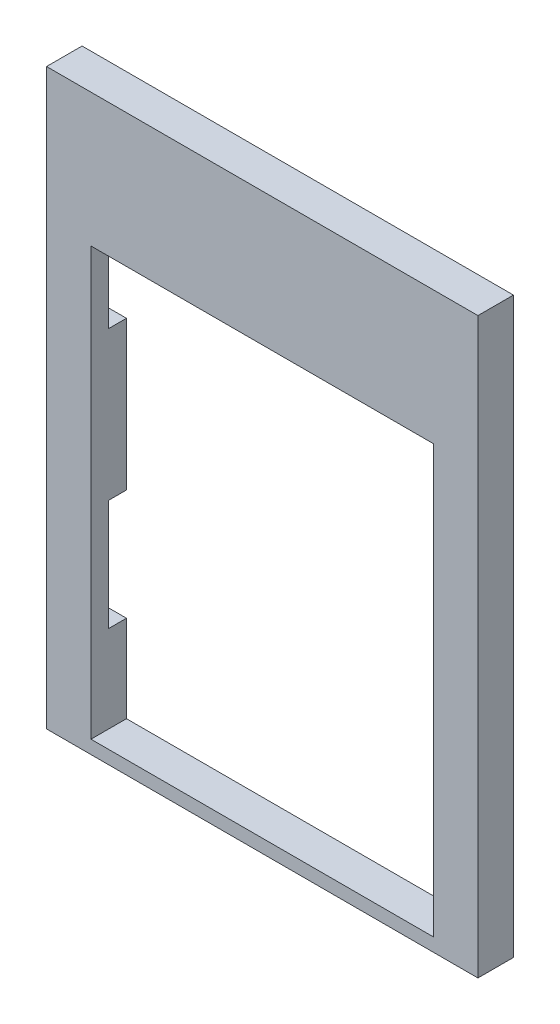
ISO-10303-21;
HEADER;
FILE_DESCRIPTION(('STEP AP214'),'2;1');
FILE_NAME('part.step','',(''),(''),'','','');
FILE_SCHEMA(('AUTOMOTIVE_DESIGN { 1 0 10303 214 1 1 1 1 }'));
ENDSEC;
DATA;
#1=APPLICATION_CONTEXT('core data for automotive mechanical design processes');
#2=APPLICATION_PROTOCOL_DEFINITION('international standard','automotive_design',2000,#1);
#3=PRODUCT_CONTEXT('',#1,'mechanical');
#4=PRODUCT('Part','Part','',(#3));
#5=PRODUCT_RELATED_PRODUCT_CATEGORY('part','',(#4));
#6=PRODUCT_DEFINITION_FORMATION('','',#4);
#7=PRODUCT_DEFINITION_CONTEXT('part definition',#1,'design');
#8=PRODUCT_DEFINITION('design','',#6,#7);
#9=PRODUCT_DEFINITION_SHAPE('','',#8);
#10=(LENGTH_UNIT() NAMED_UNIT(*) SI_UNIT(.MILLI.,.METRE.));
#11=(NAMED_UNIT(*) PLANE_ANGLE_UNIT() SI_UNIT($,.RADIAN.));
#12=(NAMED_UNIT(*) SI_UNIT($,.STERADIAN.) SOLID_ANGLE_UNIT());
#13=UNCERTAINTY_MEASURE_WITH_UNIT(LENGTH_MEASURE(1.E-05),#10,'distance_accuracy_value','');
#14=(GEOMETRIC_REPRESENTATION_CONTEXT(3) GLOBAL_UNCERTAINTY_ASSIGNED_CONTEXT((#13)) GLOBAL_UNIT_ASSIGNED_CONTEXT((#10,
#11,#12)) REPRESENTATION_CONTEXT('',''));
#15=CARTESIAN_POINT('',(0.,0.,0.));
#16=DIRECTION('',(0.,0.,1.));
#17=DIRECTION('',(1.,0.,0.));
#18=AXIS2_PLACEMENT_3D('',#15,#16,#17);
#19=CARTESIAN_POINT('',(92.1601774285357,0.,4.));
#20=DIRECTION('',(-1.,0.,0.));
#21=DIRECTION('',(0.,0.,1.));
#22=AXIS2_PLACEMENT_3D('',#19,#20,#21);
#23=PLANE('',#22);
#24=DIRECTION('',(0.,1.,0.));
#25=VECTOR('',#24,1.);
#26=CARTESIAN_POINT('',(92.1601774285357,0.,-4.));
#27=LINE('',#26,#25);
#28=CARTESIAN_POINT('',(92.1601774285357,-5.21485776415112,-4.));
#29=VERTEX_POINT('',#28);
#30=CARTESIAN_POINT('',(92.1601774285357,123.984602235849,-4.));
#31=VERTEX_POINT('',#30);
#32=EDGE_CURVE('E436',#29,#31,#27,.T.);
#33=ORIENTED_EDGE('',*,*,#32,.F.);
#34=DIRECTION('',(0.,0.,-1.));
#35=VECTOR('',#34,1.);
#36=CARTESIAN_POINT('',(92.1601774285357,-5.21485776415112,4.));
#37=LINE('',#36,#35);
#38=CARTESIAN_POINT('',(92.1601774285357,-5.21485776415112,4.));
#39=VERTEX_POINT('',#38);
#40=EDGE_CURVE('E54',#39,#29,#37,.T.);
#41=ORIENTED_EDGE('',*,*,#40,.F.);
#42=DIRECTION('',(0.,1.,0.));
#43=VECTOR('',#42,1.);
#44=CARTESIAN_POINT('',(92.1601774285357,0.,4.));
#45=LINE('',#44,#43);
#46=CARTESIAN_POINT('',(92.1601774285357,123.984602235849,4.));
#47=VERTEX_POINT('',#46);
#48=EDGE_CURVE('E405',#39,#47,#45,.T.);
#49=ORIENTED_EDGE('',*,*,#48,.T.);
#50=DIRECTION('',(0.,0.,-1.));
#51=VECTOR('',#50,1.);
#52=CARTESIAN_POINT('',(92.1601774285357,123.984602235849,4.));
#53=LINE('',#52,#51);
#54=EDGE_CURVE('E451',#47,#31,#53,.T.);
#55=ORIENTED_EDGE('',*,*,#54,.T.);
#56=EDGE_LOOP('',(#33,#41,#49,#55));
#57=FACE_BOUND('',#56,.T.);
#58=ADVANCED_FACE('F45',(#57),#23,.T.);
#59=CARTESIAN_POINT('',(0.,-5.21485776415112,4.));
#60=DIRECTION('',(0.,1.,0.));
#61=DIRECTION('',(0.,0.,1.));
#62=AXIS2_PLACEMENT_3D('',#59,#60,#61);
#63=PLANE('',#62);
#64=DIRECTION('',(1.,0.,0.));
#65=VECTOR('',#64,1.);
#66=CARTESIAN_POINT('',(0.,-5.21485776415112,-4.));
#67=LINE('',#66,#65);
#68=CARTESIAN_POINT('',(189.309527428536,-5.21485776415112,-4.));
#69=VERTEX_POINT('',#68);
#70=EDGE_CURVE('E440',#29,#69,#67,.T.);
#71=ORIENTED_EDGE('',*,*,#70,.T.);
#72=DIRECTION('',(0.,0.,-1.));
#73=VECTOR('',#72,1.);
#74=CARTESIAN_POINT('',(189.309527428536,-5.21485776415112,4.));
#75=LINE('',#74,#73);
#76=CARTESIAN_POINT('',(189.309527428536,-5.21485776415112,4.));
#77=VERTEX_POINT('',#76);
#78=EDGE_CURVE('E458',#77,#69,#75,.T.);
#79=ORIENTED_EDGE('',*,*,#78,.F.);
#80=DIRECTION('',(1.,0.,0.));
#81=VECTOR('',#80,1.);
#82=CARTESIAN_POINT('',(0.,-5.21485776415112,4.));
#83=LINE('',#82,#81);
#84=EDGE_CURVE('E409',#39,#77,#83,.T.);
#85=ORIENTED_EDGE('',*,*,#84,.F.);
#86=ORIENTED_EDGE('',*,*,#40,.T.);
#87=EDGE_LOOP('',(#71,#79,#85,#86));
#88=FACE_BOUND('',#87,.T.);
#89=ADVANCED_FACE('F543',(#88),#63,.F.);
#90=CARTESIAN_POINT('',(189.309527428536,0.,4.));
#91=DIRECTION('',(1.,0.,0.));
#92=DIRECTION('',(0.,0.,-1.));
#93=AXIS2_PLACEMENT_3D('',#90,#91,#92);
#94=PLANE('',#93);
#95=DIRECTION('',(0.,-1.,0.));
#96=VECTOR('',#95,1.);
#97=CARTESIAN_POINT('',(189.309527428536,0.,-4.));
#98=LINE('',#97,#96);
#99=CARTESIAN_POINT('',(189.309527428536,123.984602235849,-4.));
#100=VERTEX_POINT('',#99);
#101=EDGE_CURVE('E444',#100,#69,#98,.T.);
#102=ORIENTED_EDGE('',*,*,#101,.F.);
#103=DIRECTION('',(0.,0.,-1.));
#104=VECTOR('',#103,1.);
#105=CARTESIAN_POINT('',(189.309527428536,123.984602235849,4.));
#106=LINE('',#105,#104);
#107=CARTESIAN_POINT('',(189.309527428536,123.984602235849,4.));
#108=VERTEX_POINT('',#107);
#109=EDGE_CURVE('E454',#108,#100,#106,.T.);
#110=ORIENTED_EDGE('',*,*,#109,.F.);
#111=DIRECTION('',(0.,-1.,0.));
#112=VECTOR('',#111,1.);
#113=CARTESIAN_POINT('',(189.309527428536,0.,4.));
#114=LINE('',#113,#112);
#115=EDGE_CURVE('E412',#108,#77,#114,.T.);
#116=ORIENTED_EDGE('',*,*,#115,.T.);
#117=ORIENTED_EDGE('',*,*,#78,.T.);
#118=EDGE_LOOP('',(#102,#110,#116,#117));
#119=FACE_BOUND('',#118,.T.);
#120=ADVANCED_FACE('F549',(#119),#94,.T.);
#121=CARTESIAN_POINT('',(0.,93.9846022358489,4.));
#122=DIRECTION('',(0.,-1.,0.));
#123=DIRECTION('',(0.,0.,-1.));
#124=AXIS2_PLACEMENT_3D('',#121,#122,#123);
#125=PLANE('',#124);
#126=DIRECTION('',(-1.,0.,0.));
#127=VECTOR('',#126,1.);
#128=CARTESIAN_POINT('',(0.,93.9846022358489,-4.));
#129=LINE('',#128,#127);
#130=CARTESIAN_POINT('',(179.309527428536,93.9846022358489,-4.));
#131=VERTEX_POINT('',#130);
#132=CARTESIAN_POINT('',(102.160177428536,93.9846022358489,-4.));
#133=VERTEX_POINT('',#132);
#134=EDGE_CURVE('E389',#131,#133,#129,.T.);
#135=ORIENTED_EDGE('',*,*,#134,.F.);
#136=DIRECTION('',(0.,0.,-1.));
#137=VECTOR('',#136,1.);
#138=CARTESIAN_POINT('',(179.309527428536,93.9846022358489,4.));
#139=LINE('',#138,#137);
#140=CARTESIAN_POINT('',(179.309527428536,93.9846022358489,0.));
#141=VERTEX_POINT('',#140);
#142=EDGE_CURVE('E375',#141,#131,#139,.T.);
#143=ORIENTED_EDGE('',*,*,#142,.F.);
#144=DIRECTION('',(0.,0.,-1.));
#145=VECTOR('',#144,1.);
#146=CARTESIAN_POINT('',(179.309527428536,93.9846022358489,4.));
#147=LINE('',#146,#145);
#148=CARTESIAN_POINT('',(179.309527428536,93.9846022358489,4.));
#149=VERTEX_POINT('',#148);
#150=EDGE_CURVE('E455',#149,#141,#147,.T.);
#151=ORIENTED_EDGE('',*,*,#150,.F.);
#152=DIRECTION('',(-1.,0.,0.));
#153=VECTOR('',#152,1.);
#154=CARTESIAN_POINT('',(0.,93.9846022358489,4.));
#155=LINE('',#154,#153);
#156=CARTESIAN_POINT('',(102.160177428536,93.9846022358489,4.));
#157=VERTEX_POINT('',#156);
#158=EDGE_CURVE('E390',#149,#157,#155,.T.);
#159=ORIENTED_EDGE('',*,*,#158,.T.);
#160=DIRECTION('',(0.,0.,-1.));
#161=VECTOR('',#160,1.);
#162=CARTESIAN_POINT('',(102.160177428536,93.9846022358489,4.));
#163=LINE('',#162,#161);
#164=CARTESIAN_POINT('',(102.160177428536,93.9846022358489,0.));
#165=VERTEX_POINT('',#164);
#166=EDGE_CURVE('E420',#157,#165,#163,.T.);
#167=ORIENTED_EDGE('',*,*,#166,.T.);
#168=DIRECTION('',(0.,0.,1.));
#169=VECTOR('',#168,1.);
#170=CARTESIAN_POINT('',(102.160177428536,93.9846022358489,4.));
#171=LINE('',#170,#169);
#172=EDGE_CURVE('E386',#133,#165,#171,.T.);
#173=ORIENTED_EDGE('',*,*,#172,.F.);
#174=EDGE_LOOP('',(#135,#143,#151,#159,#167,#173));
#175=FACE_BOUND('',#174,.T.);
#176=ADVANCED_FACE('F47',(#175),#125,.T.);
#177=CARTESIAN_POINT('',(179.309527428536,5.72056394508151E-13,4.));
#178=DIRECTION('',(-1.,0.,0.));
#179=DIRECTION('',(0.,-1.,0.));
#180=AXIS2_PLACEMENT_3D('',#177,#178,#179);
#181=PLANE('',#180);
#182=DIRECTION('',(0.,0.,1.));
#183=VECTOR('',#182,1.);
#184=CARTESIAN_POINT('',(179.309527428536,42.3848722358489,-4.));
#185=LINE('',#184,#183);
#186=CARTESIAN_POINT('',(179.309527428536,42.3848722358489,-4.));
#187=VERTEX_POINT('',#186);
#188=CARTESIAN_POINT('',(179.309527428536,42.3848722358489,0.));
#189=VERTEX_POINT('',#188);
#190=EDGE_CURVE('E302',#187,#189,#185,.T.);
#191=ORIENTED_EDGE('',*,*,#190,.T.);
#192=DIRECTION('',(0.,-1.,0.));
#193=VECTOR('',#192,1.);
#194=CARTESIAN_POINT('',(179.309527428536,42.3848722358489,0.));
#195=LINE('',#194,#193);
#196=CARTESIAN_POINT('',(179.309527428536,17.3848722358488,0.));
#197=VERTEX_POINT('',#196);
#198=EDGE_CURVE('E323',#189,#197,#195,.T.);
#199=ORIENTED_EDGE('',*,*,#198,.T.);
#200=DIRECTION('',(0.,0.,1.));
#201=VECTOR('',#200,1.);
#202=CARTESIAN_POINT('',(179.309527428536,17.3848722358488,-4.));
#203=LINE('',#202,#201);
#204=CARTESIAN_POINT('',(179.309527428536,17.3848722358488,-4.));
#205=VERTEX_POINT('',#204);
#206=EDGE_CURVE('E306',#205,#197,#203,.T.);
#207=ORIENTED_EDGE('',*,*,#206,.F.);
#208=DIRECTION('',(0.,1.,0.));
#209=VECTOR('',#208,1.);
#210=CARTESIAN_POINT('',(179.309527428536,5.72056394508151E-13,-4.));
#211=LINE('',#210,#209);
#212=CARTESIAN_POINT('',(179.309527428536,-2.21485776415112,-4.));
#213=VERTEX_POINT('',#212);
#214=EDGE_CURVE('E425',#213,#205,#211,.T.);
#215=ORIENTED_EDGE('',*,*,#214,.F.);
#216=DIRECTION('',(0.,0.,-1.));
#217=VECTOR('',#216,1.);
#218=CARTESIAN_POINT('',(179.309527428536,-2.21485776415112,4.));
#219=LINE('',#218,#217);
#220=CARTESIAN_POINT('',(179.309527428536,-2.21485776415112,4.));
#221=VERTEX_POINT('',#220);
#222=EDGE_CURVE('E470',#221,#213,#219,.T.);
#223=ORIENTED_EDGE('',*,*,#222,.F.);
#224=DIRECTION('',(0.,1.,0.));
#225=VECTOR('',#224,1.);
#226=CARTESIAN_POINT('',(179.309527428536,5.72056394508151E-13,4.));
#227=LINE('',#226,#225);
#228=EDGE_CURVE('E394',#221,#149,#227,.T.);
#229=ORIENTED_EDGE('',*,*,#228,.T.);
#230=ORIENTED_EDGE('',*,*,#150,.T.);
#231=DIRECTION('',(0.,-1.,0.));
#232=VECTOR('',#231,1.);
#233=CARTESIAN_POINT('',(179.309527428536,100.884872235849,0.));
#234=LINE('',#233,#232);
#235=CARTESIAN_POINT('',(179.309527428536,75.8848722358489,0.));
#236=VERTEX_POINT('',#235);
#237=EDGE_CURVE('E360',#141,#236,#234,.T.);
#238=ORIENTED_EDGE('',*,*,#237,.T.);
#239=DIRECTION('',(0.,0.,1.));
#240=VECTOR('',#239,1.);
#241=CARTESIAN_POINT('',(179.309527428536,75.8848722358489,-4.));
#242=LINE('',#241,#240);
#243=CARTESIAN_POINT('',(179.309527428536,75.8848722358489,-4.));
#244=VERTEX_POINT('',#243);
#245=EDGE_CURVE('E379',#244,#236,#242,.T.);
#246=ORIENTED_EDGE('',*,*,#245,.F.);
#247=EDGE_CURVE('E424',#187,#244,#211,.T.);
#248=ORIENTED_EDGE('',*,*,#247,.F.);
#249=EDGE_LOOP('',(#191,#199,#207,#215,#223,#229,#230,#238,#246,#248));
#250=FACE_BOUND('',#249,.T.);
#251=ADVANCED_FACE('F476',(#250),#181,.T.);
#252=CARTESIAN_POINT('',(0.,-2.21485776415111,4.));
#253=DIRECTION('',(0.,-1.,0.));
#254=DIRECTION('',(1.,0.,0.));
#255=AXIS2_PLACEMENT_3D('',#252,#253,#254);
#256=PLANE('',#255);
#257=DIRECTION('',(-1.,0.,0.));
#258=VECTOR('',#257,1.);
#259=CARTESIAN_POINT('',(0.,-2.21485776415111,-4.));
#260=LINE('',#259,#258);
#261=CARTESIAN_POINT('',(102.160177428536,-2.21485776415112,-4.));
#262=VERTEX_POINT('',#261);
#263=EDGE_CURVE('E429',#213,#262,#260,.T.);
#264=ORIENTED_EDGE('',*,*,#263,.T.);
#265=DIRECTION('',(0.,0.,-1.));
#266=VECTOR('',#265,1.);
#267=CARTESIAN_POINT('',(102.160177428536,-2.21485776415112,4.));
#268=LINE('',#267,#266);
#269=CARTESIAN_POINT('',(102.160177428536,-2.21485776415112,4.));
#270=VERTEX_POINT('',#269);
#271=EDGE_CURVE('E466',#270,#262,#268,.T.);
#272=ORIENTED_EDGE('',*,*,#271,.F.);
#273=DIRECTION('',(-1.,0.,0.));
#274=VECTOR('',#273,1.);
#275=CARTESIAN_POINT('',(0.,-2.21485776415111,4.));
#276=LINE('',#275,#274);
#277=EDGE_CURVE('E399',#221,#270,#276,.T.);
#278=ORIENTED_EDGE('',*,*,#277,.F.);
#279=ORIENTED_EDGE('',*,*,#222,.T.);
#280=EDGE_LOOP('',(#264,#272,#278,#279));
#281=FACE_BOUND('',#280,.T.);
#282=ADVANCED_FACE('F558',(#281),#256,.F.);
#283=CARTESIAN_POINT('',(102.160177428536,0.,4.));
#284=DIRECTION('',(-1.,0.,0.));
#285=DIRECTION('',(0.,0.,1.));
#286=AXIS2_PLACEMENT_3D('',#283,#284,#285);
#287=PLANE('',#286);
#288=DIRECTION('',(0.,1.,0.));
#289=VECTOR('',#288,1.);
#290=CARTESIAN_POINT('',(102.160177428536,0.,-4.));
#291=LINE('',#290,#289);
#292=CARTESIAN_POINT('',(102.160177428536,42.3848722358489,-4.));
#293=VERTEX_POINT('',#292);
#294=CARTESIAN_POINT('',(102.160177428536,75.8848722358489,-4.));
#295=VERTEX_POINT('',#294);
#296=EDGE_CURVE('E432',#293,#295,#291,.T.);
#297=ORIENTED_EDGE('',*,*,#296,.T.);
#298=DIRECTION('',(0.,0.,1.));
#299=VECTOR('',#298,1.);
#300=CARTESIAN_POINT('',(102.160177428536,75.8848722358489,-4.));
#301=LINE('',#300,#299);
#302=CARTESIAN_POINT('',(102.160177428536,75.8848722358489,0.));
#303=VERTEX_POINT('',#302);
#304=EDGE_CURVE('E266',#295,#303,#301,.T.);
#305=ORIENTED_EDGE('',*,*,#304,.T.);
#306=DIRECTION('',(0.,1.,0.));
#307=VECTOR('',#306,1.);
#308=CARTESIAN_POINT('',(102.160177428536,100.884872235849,0.));
#309=LINE('',#308,#307);
#310=EDGE_CURVE('E275',#303,#165,#309,.T.);
#311=ORIENTED_EDGE('',*,*,#310,.T.);
#312=ORIENTED_EDGE('',*,*,#166,.F.);
#313=DIRECTION('',(0.,1.,0.));
#314=VECTOR('',#313,1.);
#315=CARTESIAN_POINT('',(102.160177428536,0.,4.));
#316=LINE('',#315,#314);
#317=EDGE_CURVE('E402',#270,#157,#316,.T.);
#318=ORIENTED_EDGE('',*,*,#317,.F.);
#319=ORIENTED_EDGE('',*,*,#271,.T.);
#320=CARTESIAN_POINT('',(102.160177428536,17.3848722358488,-4.));
#321=VERTEX_POINT('',#320);
#322=EDGE_CURVE('E433',#262,#321,#291,.T.);
#323=ORIENTED_EDGE('',*,*,#322,.T.);
#324=DIRECTION('',(0.,0.,1.));
#325=VECTOR('',#324,1.);
#326=CARTESIAN_POINT('',(102.160177428536,17.3848722358488,-4.));
#327=LINE('',#326,#325);
#328=CARTESIAN_POINT('',(102.160177428536,17.3848722358488,0.));
#329=VERTEX_POINT('',#328);
#330=EDGE_CURVE('E224',#321,#329,#327,.T.);
#331=ORIENTED_EDGE('',*,*,#330,.T.);
#332=DIRECTION('',(0.,1.,0.));
#333=VECTOR('',#332,1.);
#334=CARTESIAN_POINT('',(102.160177428536,42.3848722358489,0.));
#335=LINE('',#334,#333);
#336=CARTESIAN_POINT('',(102.160177428536,42.3848722358489,0.));
#337=VERTEX_POINT('',#336);
#338=EDGE_CURVE('E231',#329,#337,#335,.T.);
#339=ORIENTED_EDGE('',*,*,#338,.T.);
#340=DIRECTION('',(0.,0.,1.));
#341=VECTOR('',#340,1.);
#342=CARTESIAN_POINT('',(102.160177428536,42.3848722358489,-4.));
#343=LINE('',#342,#341);
#344=EDGE_CURVE('E213',#293,#337,#343,.T.);
#345=ORIENTED_EDGE('',*,*,#344,.F.);
#346=EDGE_LOOP('',(#297,#305,#311,#312,#318,#319,#323,#331,#339,#345));
#347=FACE_BOUND('',#346,.T.);
#348=ADVANCED_FACE('F238',(#347),#287,.F.);
#349=CARTESIAN_POINT('',(0.,123.984602235849,4.));
#350=DIRECTION('',(0.,1.,0.));
#351=DIRECTION('',(0.,0.,1.));
#352=AXIS2_PLACEMENT_3D('',#349,#350,#351);
#353=PLANE('',#352);
#354=DIRECTION('',(1.,0.,0.));
#355=VECTOR('',#354,1.);
#356=CARTESIAN_POINT('',(0.,123.984602235849,-4.));
#357=LINE('',#356,#355);
#358=EDGE_CURVE('E395',#31,#100,#357,.T.);
#359=ORIENTED_EDGE('',*,*,#358,.F.);
#360=ORIENTED_EDGE('',*,*,#54,.F.);
#361=DIRECTION('',(1.,0.,0.));
#362=VECTOR('',#361,1.);
#363=CARTESIAN_POINT('',(0.,123.984602235849,4.));
#364=LINE('',#363,#362);
#365=EDGE_CURVE('E416',#47,#108,#364,.T.);
#366=ORIENTED_EDGE('',*,*,#365,.T.);
#367=ORIENTED_EDGE('',*,*,#109,.T.);
#368=EDGE_LOOP('',(#359,#360,#366,#367));
#369=FACE_BOUND('',#368,.T.);
#370=ADVANCED_FACE('F557',(#369),#353,.T.);
#371=CARTESIAN_POINT('',(0.,0.,4.));
#372=DIRECTION('',(0.,0.,1.));
#373=DIRECTION('',(1.,0.,0.));
#374=AXIS2_PLACEMENT_3D('',#371,#372,#373);
#375=PLANE('',#374);
#376=ORIENTED_EDGE('',*,*,#158,.F.);
#377=ORIENTED_EDGE('',*,*,#228,.F.);
#378=ORIENTED_EDGE('',*,*,#277,.T.);
#379=ORIENTED_EDGE('',*,*,#317,.T.);
#380=EDGE_LOOP('',(#376,#377,#378,#379));
#381=FACE_BOUND('',#380,.T.);
#382=ORIENTED_EDGE('',*,*,#48,.F.);
#383=ORIENTED_EDGE('',*,*,#84,.T.);
#384=ORIENTED_EDGE('',*,*,#115,.F.);
#385=ORIENTED_EDGE('',*,*,#365,.F.);
#386=EDGE_LOOP('',(#382,#383,#384,#385));
#387=FACE_BOUND('',#386,.T.);
#388=ADVANCED_FACE('F484',(#381,#387),#375,.T.);
#389=CARTESIAN_POINT('',(0.,0.,-4.));
#390=DIRECTION('',(0.,0.,1.));
#391=DIRECTION('',(1.,0.,0.));
#392=AXIS2_PLACEMENT_3D('',#389,#390,#391);
#393=PLANE('',#392);
#394=ORIENTED_EDGE('',*,*,#134,.T.);
#395=DIRECTION('',(0.,1.,0.));
#396=VECTOR('',#395,1.);
#397=CARTESIAN_POINT('',(102.160177428535,-3.40261743542854E-13,-4.));
#398=LINE('',#397,#396);
#399=CARTESIAN_POINT('',(102.160177428536,100.884872235849,-4.));
#400=VERTEX_POINT('',#399);
#401=EDGE_CURVE('E11',#133,#400,#398,.T.);
#402=ORIENTED_EDGE('',*,*,#401,.T.);
#403=DIRECTION('',(-1.,0.,0.));
#404=VECTOR('',#403,1.);
#405=CARTESIAN_POINT('',(102.160177428536,100.884872235849,-4.));
#406=LINE('',#405,#404);
#407=CARTESIAN_POINT('',(94.1601774285357,100.884872235849,-4.));
#408=VERTEX_POINT('',#407);
#409=EDGE_CURVE('E298',#400,#408,#406,.T.);
#410=ORIENTED_EDGE('',*,*,#409,.T.);
#411=DIRECTION('',(0.,-1.,0.));
#412=VECTOR('',#411,1.);
#413=CARTESIAN_POINT('',(94.1601774285357,100.884872235849,-4.));
#414=LINE('',#413,#412);
#415=CARTESIAN_POINT('',(94.1601774285357,75.8848722358489,-4.));
#416=VERTEX_POINT('',#415);
#417=EDGE_CURVE('E294',#408,#416,#414,.T.);
#418=ORIENTED_EDGE('',*,*,#417,.T.);
#419=DIRECTION('',(1.,0.,0.));
#420=VECTOR('',#419,1.);
#421=CARTESIAN_POINT('',(102.160177428536,75.8848722358489,-4.));
#422=LINE('',#421,#420);
#423=EDGE_CURVE('E61',#416,#295,#422,.T.);
#424=ORIENTED_EDGE('',*,*,#423,.T.);
#425=ORIENTED_EDGE('',*,*,#296,.F.);
#426=DIRECTION('',(-1.,0.,0.));
#427=VECTOR('',#426,1.);
#428=CARTESIAN_POINT('',(102.160177428536,42.3848722358489,-4.));
#429=LINE('',#428,#427);
#430=CARTESIAN_POINT('',(94.1601774285357,42.3848722358489,-4.));
#431=VERTEX_POINT('',#430);
#432=EDGE_CURVE('E218',#293,#431,#429,.T.);
#433=ORIENTED_EDGE('',*,*,#432,.T.);
#434=DIRECTION('',(0.,-1.,0.));
#435=VECTOR('',#434,1.);
#436=CARTESIAN_POINT('',(94.1601774285357,42.3848722358489,-4.));
#437=LINE('',#436,#435);
#438=CARTESIAN_POINT('',(94.1601774285357,17.3848722358488,-4.));
#439=VERTEX_POINT('',#438);
#440=EDGE_CURVE('E246',#431,#439,#437,.T.);
#441=ORIENTED_EDGE('',*,*,#440,.T.);
#442=DIRECTION('',(1.,0.,0.));
#443=VECTOR('',#442,1.);
#444=CARTESIAN_POINT('',(102.160177428536,17.3848722358488,-4.));
#445=LINE('',#444,#443);
#446=EDGE_CURVE('E252',#439,#321,#445,.T.);
#447=ORIENTED_EDGE('',*,*,#446,.T.);
#448=ORIENTED_EDGE('',*,*,#322,.F.);
#449=ORIENTED_EDGE('',*,*,#263,.F.);
#450=ORIENTED_EDGE('',*,*,#214,.T.);
#451=DIRECTION('',(1.,0.,0.));
#452=VECTOR('',#451,1.);
#453=CARTESIAN_POINT('',(179.309527428536,17.3848722358488,-4.));
#454=LINE('',#453,#452);
#455=CARTESIAN_POINT('',(187.309527428536,17.3848722358488,-4.));
#456=VERTEX_POINT('',#455);
#457=EDGE_CURVE('E332',#205,#456,#454,.T.);
#458=ORIENTED_EDGE('',*,*,#457,.T.);
#459=DIRECTION('',(0.,1.,0.));
#460=VECTOR('',#459,1.);
#461=CARTESIAN_POINT('',(187.309527428536,42.3848722358489,-4.));
#462=LINE('',#461,#460);
#463=CARTESIAN_POINT('',(187.309527428536,42.3848722358489,-4.));
#464=VERTEX_POINT('',#463);
#465=EDGE_CURVE('E69',#456,#464,#462,.T.);
#466=ORIENTED_EDGE('',*,*,#465,.T.);
#467=DIRECTION('',(-1.,0.,0.));
#468=VECTOR('',#467,1.);
#469=CARTESIAN_POINT('',(179.309527428536,42.3848722358489,-4.));
#470=LINE('',#469,#468);
#471=EDGE_CURVE('E319',#464,#187,#470,.T.);
#472=ORIENTED_EDGE('',*,*,#471,.T.);
#473=ORIENTED_EDGE('',*,*,#247,.T.);
#474=DIRECTION('',(1.,0.,0.));
#475=VECTOR('',#474,1.);
#476=CARTESIAN_POINT('',(179.309527428536,75.8848722358489,-4.));
#477=LINE('',#476,#475);
#478=CARTESIAN_POINT('',(187.309527428536,75.8848722358489,-4.));
#479=VERTEX_POINT('',#478);
#480=EDGE_CURVE('E348',#244,#479,#477,.T.);
#481=ORIENTED_EDGE('',*,*,#480,.T.);
#482=DIRECTION('',(0.,1.,0.));
#483=VECTOR('',#482,1.);
#484=CARTESIAN_POINT('',(187.309527428536,100.884872235849,-4.));
#485=LINE('',#484,#483);
#486=CARTESIAN_POINT('',(187.309527428536,100.884872235849,-4.));
#487=VERTEX_POINT('',#486);
#488=EDGE_CURVE('E352',#479,#487,#485,.T.);
#489=ORIENTED_EDGE('',*,*,#488,.T.);
#490=DIRECTION('',(-1.,0.,0.));
#491=VECTOR('',#490,1.);
#492=CARTESIAN_POINT('',(179.309527428536,100.884872235849,-4.));
#493=LINE('',#492,#491);
#494=CARTESIAN_POINT('',(179.309527428536,100.884872235849,-4.));
#495=VERTEX_POINT('',#494);
#496=EDGE_CURVE('E339',#487,#495,#493,.T.);
#497=ORIENTED_EDGE('',*,*,#496,.T.);
#498=DIRECTION('',(0.,-1.,0.));
#499=VECTOR('',#498,1.);
#500=CARTESIAN_POINT('',(179.309527428536,100.884872235849,-4.));
#501=LINE('',#500,#499);
#502=EDGE_CURVE('E343',#495,#131,#501,.T.);
#503=ORIENTED_EDGE('',*,*,#502,.T.);
#504=EDGE_LOOP('',(#394,#402,#410,#418,#424,#425,#433,#441,#447,#448,#449,#450,#458,#466,#472,
#473,#481,#489,#497,#503));
#505=FACE_BOUND('',#504,.T.);
#506=ORIENTED_EDGE('',*,*,#32,.T.);
#507=ORIENTED_EDGE('',*,*,#358,.T.);
#508=ORIENTED_EDGE('',*,*,#101,.T.);
#509=ORIENTED_EDGE('',*,*,#70,.F.);
#510=EDGE_LOOP('',(#506,#507,#508,#509));
#511=FACE_BOUND('',#510,.T.);
#512=ADVANCED_FACE('F495',(#505,#511),#393,.F.);
#513=CARTESIAN_POINT('',(179.309527428536,100.884872235849,-4.));
#514=DIRECTION('',(0.,1.,0.));
#515=DIRECTION('',(0.,0.,1.));
#516=AXIS2_PLACEMENT_3D('',#513,#514,#515);
#517=PLANE('',#516);
#518=DIRECTION('',(-1.,0.,0.));
#519=VECTOR('',#518,1.);
#520=CARTESIAN_POINT('',(179.309527428536,100.884872235849,0.));
#521=LINE('',#520,#519);
#522=CARTESIAN_POINT('',(187.309527428536,100.884872235849,0.));
#523=VERTEX_POINT('',#522);
#524=CARTESIAN_POINT('',(179.309527428536,100.884872235849,0.));
#525=VERTEX_POINT('',#524);
#526=EDGE_CURVE('E291',#523,#525,#521,.T.);
#527=ORIENTED_EDGE('',*,*,#526,.T.);
#528=DIRECTION('',(0.,0.,1.));
#529=VECTOR('',#528,1.);
#530=CARTESIAN_POINT('',(179.309527428536,100.884872235849,-4.));
#531=LINE('',#530,#529);
#532=EDGE_CURVE('E356',#495,#525,#531,.T.);
#533=ORIENTED_EDGE('',*,*,#532,.F.);
#534=ORIENTED_EDGE('',*,*,#496,.F.);
#535=DIRECTION('',(0.,0.,1.));
#536=VECTOR('',#535,1.);
#537=CARTESIAN_POINT('',(187.309527428536,100.884872235849,-4.));
#538=LINE('',#537,#536);
#539=EDGE_CURVE('E372',#487,#523,#538,.T.);
#540=ORIENTED_EDGE('',*,*,#539,.T.);
#541=EDGE_LOOP('',(#527,#533,#534,#540));
#542=FACE_BOUND('',#541,.T.);
#543=ADVANCED_FACE('F508',(#542),#517,.F.);
#544=CARTESIAN_POINT('',(187.309527428536,100.884872235849,-4.));
#545=DIRECTION('',(1.,0.,0.));
#546=DIRECTION('',(0.,0.,-1.));
#547=AXIS2_PLACEMENT_3D('',#544,#545,#546);
#548=PLANE('',#547);
#549=DIRECTION('',(0.,1.,0.));
#550=VECTOR('',#549,1.);
#551=CARTESIAN_POINT('',(187.309527428536,100.884872235849,0.));
#552=LINE('',#551,#550);
#553=CARTESIAN_POINT('',(187.309527428536,75.8848722358489,0.));
#554=VERTEX_POINT('',#553);
#555=EDGE_CURVE('E344',#554,#523,#552,.T.);
#556=ORIENTED_EDGE('',*,*,#555,.T.);
#557=ORIENTED_EDGE('',*,*,#539,.F.);
#558=ORIENTED_EDGE('',*,*,#488,.F.);
#559=DIRECTION('',(0.,0.,1.));
#560=VECTOR('',#559,1.);
#561=CARTESIAN_POINT('',(187.309527428536,75.8848722358489,-4.));
#562=LINE('',#561,#560);
#563=EDGE_CURVE('E376',#479,#554,#562,.T.);
#564=ORIENTED_EDGE('',*,*,#563,.T.);
#565=EDGE_LOOP('',(#556,#557,#558,#564));
#566=FACE_BOUND('',#565,.T.);
#567=ADVANCED_FACE('F511',(#566),#548,.F.);
#568=CARTESIAN_POINT('',(179.309527428536,75.8848722358489,-4.));
#569=DIRECTION('',(0.,-1.,0.));
#570=DIRECTION('',(0.,0.,-1.));
#571=AXIS2_PLACEMENT_3D('',#568,#569,#570);
#572=PLANE('',#571);
#573=DIRECTION('',(1.,0.,0.));
#574=VECTOR('',#573,1.);
#575=CARTESIAN_POINT('',(179.309527428536,75.8848722358489,0.));
#576=LINE('',#575,#574);
#577=EDGE_CURVE('E365',#236,#554,#576,.T.);
#578=ORIENTED_EDGE('',*,*,#577,.T.);
#579=ORIENTED_EDGE('',*,*,#563,.F.);
#580=ORIENTED_EDGE('',*,*,#480,.F.);
#581=ORIENTED_EDGE('',*,*,#245,.T.);
#582=EDGE_LOOP('',(#578,#579,#580,#581));
#583=FACE_BOUND('',#582,.T.);
#584=ADVANCED_FACE('F513',(#583),#572,.F.);
#585=CARTESIAN_POINT('',(179.309527428536,100.884872235849,-4.));
#586=DIRECTION('',(-1.,0.,0.));
#587=DIRECTION('',(0.,-1.,0.));
#588=AXIS2_PLACEMENT_3D('',#585,#586,#587);
#589=PLANE('',#588);
#590=ORIENTED_EDGE('',*,*,#142,.T.);
#591=ORIENTED_EDGE('',*,*,#502,.F.);
#592=ORIENTED_EDGE('',*,*,#532,.T.);
#593=EDGE_CURVE('E361',#525,#141,#234,.T.);
#594=ORIENTED_EDGE('',*,*,#593,.T.);
#595=EDGE_LOOP('',(#590,#591,#592,#594));
#596=FACE_BOUND('',#595,.T.);
#597=ADVANCED_FACE('F500',(#596),#589,.F.);
#598=CARTESIAN_POINT('',(0.,0.,0.));
#599=DIRECTION('',(0.,0.,-1.));
#600=DIRECTION('',(-1.,0.,0.));
#601=AXIS2_PLACEMENT_3D('',#598,#599,#600);
#602=PLANE('',#601);
#603=ORIENTED_EDGE('',*,*,#526,.F.);
#604=ORIENTED_EDGE('',*,*,#555,.F.);
#605=ORIENTED_EDGE('',*,*,#577,.F.);
#606=ORIENTED_EDGE('',*,*,#237,.F.);
#607=ORIENTED_EDGE('',*,*,#593,.F.);
#608=EDGE_LOOP('',(#603,#604,#605,#606,#607));
#609=FACE_BOUND('',#608,.T.);
#610=ADVANCED_FACE('F504',(#609),#602,.T.);
#611=CARTESIAN_POINT('',(102.160177428536,42.3848722358489,-4.));
#612=DIRECTION('',(0.,1.,0.));
#613=DIRECTION('',(-1.,0.,0.));
#614=AXIS2_PLACEMENT_3D('',#611,#612,#613);
#615=PLANE('',#614);
#616=DIRECTION('',(-1.,0.,0.));
#617=VECTOR('',#616,1.);
#618=CARTESIAN_POINT('',(102.160177428536,42.3848722358489,0.));
#619=LINE('',#618,#617);
#620=CARTESIAN_POINT('',(94.1601774285357,42.3848722358489,0.));
#621=VERTEX_POINT('',#620);
#622=EDGE_CURVE('E216',#337,#621,#619,.T.);
#623=ORIENTED_EDGE('',*,*,#622,.T.);
#624=DIRECTION('',(0.,0.,1.));
#625=VECTOR('',#624,1.);
#626=CARTESIAN_POINT('',(94.1601774285357,42.3848722358489,-4.));
#627=LINE('',#626,#625);
#628=EDGE_CURVE('E256',#431,#621,#627,.T.);
#629=ORIENTED_EDGE('',*,*,#628,.F.);
#630=ORIENTED_EDGE('',*,*,#432,.F.);
#631=ORIENTED_EDGE('',*,*,#344,.T.);
#632=EDGE_LOOP('',(#623,#629,#630,#631));
#633=FACE_BOUND('',#632,.T.);
#634=ADVANCED_FACE('F215',(#633),#615,.F.);
#635=CARTESIAN_POINT('',(102.160177428536,17.3848722358488,-4.));
#636=DIRECTION('',(0.,-1.,0.));
#637=DIRECTION('',(0.,0.,-1.));
#638=AXIS2_PLACEMENT_3D('',#635,#636,#637);
#639=PLANE('',#638);
#640=DIRECTION('',(1.,0.,0.));
#641=VECTOR('',#640,1.);
#642=CARTESIAN_POINT('',(102.160177428536,17.3848722358488,0.));
#643=LINE('',#642,#641);
#644=CARTESIAN_POINT('',(94.1601774285357,17.3848722358488,0.));
#645=VERTEX_POINT('',#644);
#646=EDGE_CURVE('E241',#645,#329,#643,.T.);
#647=ORIENTED_EDGE('',*,*,#646,.T.);
#648=ORIENTED_EDGE('',*,*,#330,.F.);
#649=ORIENTED_EDGE('',*,*,#446,.F.);
#650=DIRECTION('',(0.,0.,1.));
#651=VECTOR('',#650,1.);
#652=CARTESIAN_POINT('',(94.1601774285357,17.3848722358488,-4.));
#653=LINE('',#652,#651);
#654=EDGE_CURVE('E910',#439,#645,#653,.T.);
#655=ORIENTED_EDGE('',*,*,#654,.T.);
#656=EDGE_LOOP('',(#647,#648,#649,#655));
#657=FACE_BOUND('',#656,.T.);
#658=ADVANCED_FACE('F681',(#657),#639,.F.);
#659=CARTESIAN_POINT('',(94.1601774285357,42.3848722358489,-4.));
#660=DIRECTION('',(-1.,0.,0.));
#661=DIRECTION('',(0.,0.,1.));
#662=AXIS2_PLACEMENT_3D('',#659,#660,#661);
#663=PLANE('',#662);
#664=DIRECTION('',(0.,-1.,0.));
#665=VECTOR('',#664,1.);
#666=CARTESIAN_POINT('',(94.1601774285357,42.3848722358489,0.));
#667=LINE('',#666,#665);
#668=EDGE_CURVE('E234',#621,#645,#667,.T.);
#669=ORIENTED_EDGE('',*,*,#668,.T.);
#670=ORIENTED_EDGE('',*,*,#654,.F.);
#671=ORIENTED_EDGE('',*,*,#440,.F.);
#672=ORIENTED_EDGE('',*,*,#628,.T.);
#673=EDGE_LOOP('',(#669,#670,#671,#672));
#674=FACE_BOUND('',#673,.T.);
#675=ADVANCED_FACE('F671',(#674),#663,.F.);
#676=CARTESIAN_POINT('',(0.,0.,0.));
#677=DIRECTION('',(0.,0.,1.));
#678=DIRECTION('',(1.,0.,0.));
#679=AXIS2_PLACEMENT_3D('',#676,#677,#678);
#680=PLANE('',#679);
#681=ORIENTED_EDGE('',*,*,#622,.F.);
#682=ORIENTED_EDGE('',*,*,#338,.F.);
#683=ORIENTED_EDGE('',*,*,#646,.F.);
#684=ORIENTED_EDGE('',*,*,#668,.F.);
#685=EDGE_LOOP('',(#681,#682,#683,#684));
#686=FACE_BOUND('',#685,.T.);
#687=ADVANCED_FACE('F229',(#686),#680,.F.);
#688=CARTESIAN_POINT('',(179.309527428536,42.3848722358489,-4.));
#689=DIRECTION('',(0.,1.,0.));
#690=DIRECTION('',(-1.,0.,0.));
#691=AXIS2_PLACEMENT_3D('',#688,#689,#690);
#692=PLANE('',#691);
#693=DIRECTION('',(-1.,0.,0.));
#694=VECTOR('',#693,1.);
#695=CARTESIAN_POINT('',(179.309527428536,42.3848722358489,0.));
#696=LINE('',#695,#694);
#697=CARTESIAN_POINT('',(187.309527428536,42.3848722358489,0.));
#698=VERTEX_POINT('',#697);
#699=EDGE_CURVE('E274',#698,#189,#696,.T.);
#700=ORIENTED_EDGE('',*,*,#699,.T.);
#701=ORIENTED_EDGE('',*,*,#190,.F.);
#702=ORIENTED_EDGE('',*,*,#471,.F.);
#703=DIRECTION('',(0.,0.,1.));
#704=VECTOR('',#703,1.);
#705=CARTESIAN_POINT('',(187.309527428536,42.3848722358489,-4.));
#706=LINE('',#705,#704);
#707=EDGE_CURVE('E236',#464,#698,#706,.T.);
#708=ORIENTED_EDGE('',*,*,#707,.T.);
#709=EDGE_LOOP('',(#700,#701,#702,#708));
#710=FACE_BOUND('',#709,.T.);
#711=ADVANCED_FACE('F598',(#710),#692,.F.);
#712=CARTESIAN_POINT('',(187.309527428536,42.3848722358489,-4.));
#713=DIRECTION('',(1.,0.,0.));
#714=DIRECTION('',(0.,0.,-1.));
#715=AXIS2_PLACEMENT_3D('',#712,#713,#714);
#716=PLANE('',#715);
#717=DIRECTION('',(0.,1.,0.));
#718=VECTOR('',#717,1.);
#719=CARTESIAN_POINT('',(187.309527428536,42.3848722358489,0.));
#720=LINE('',#719,#718);
#721=CARTESIAN_POINT('',(187.309527428536,17.3848722358488,0.));
#722=VERTEX_POINT('',#721);
#723=EDGE_CURVE('E314',#722,#698,#720,.T.);
#724=ORIENTED_EDGE('',*,*,#723,.T.);
#725=ORIENTED_EDGE('',*,*,#707,.F.);
#726=ORIENTED_EDGE('',*,*,#465,.F.);
#727=DIRECTION('',(0.,0.,1.));
#728=VECTOR('',#727,1.);
#729=CARTESIAN_POINT('',(187.309527428536,17.3848722358488,-4.));
#730=LINE('',#729,#728);
#731=EDGE_CURVE('E309',#456,#722,#730,.T.);
#732=ORIENTED_EDGE('',*,*,#731,.T.);
#733=EDGE_LOOP('',(#724,#725,#726,#732));
#734=FACE_BOUND('',#733,.T.);
#735=ADVANCED_FACE('F595',(#734),#716,.F.);
#736=CARTESIAN_POINT('',(179.309527428536,17.3848722358488,-4.));
#737=DIRECTION('',(0.,-1.,0.));
#738=DIRECTION('',(0.,0.,-1.));
#739=AXIS2_PLACEMENT_3D('',#736,#737,#738);
#740=PLANE('',#739);
#741=DIRECTION('',(1.,0.,0.));
#742=VECTOR('',#741,1.);
#743=CARTESIAN_POINT('',(179.309527428536,17.3848722358488,0.));
#744=LINE('',#743,#742);
#745=EDGE_CURVE('E318',#197,#722,#744,.T.);
#746=ORIENTED_EDGE('',*,*,#745,.T.);
#747=ORIENTED_EDGE('',*,*,#731,.F.);
#748=ORIENTED_EDGE('',*,*,#457,.F.);
#749=ORIENTED_EDGE('',*,*,#206,.T.);
#750=EDGE_LOOP('',(#746,#747,#748,#749));
#751=FACE_BOUND('',#750,.T.);
#752=ADVANCED_FACE('F593',(#751),#740,.F.);
#753=CARTESIAN_POINT('',(0.,0.,0.));
#754=DIRECTION('',(0.,0.,-1.));
#755=DIRECTION('',(-1.,0.,0.));
#756=AXIS2_PLACEMENT_3D('',#753,#754,#755);
#757=PLANE('',#756);
#758=ORIENTED_EDGE('',*,*,#699,.F.);
#759=ORIENTED_EDGE('',*,*,#723,.F.);
#760=ORIENTED_EDGE('',*,*,#745,.F.);
#761=ORIENTED_EDGE('',*,*,#198,.F.);
#762=EDGE_LOOP('',(#758,#759,#760,#761));
#763=FACE_BOUND('',#762,.T.);
#764=ADVANCED_FACE('F590',(#763),#757,.T.);
#765=CARTESIAN_POINT('',(102.160177428536,100.884872235849,-4.));
#766=DIRECTION('',(0.,1.,0.));
#767=DIRECTION('',(0.,0.,1.));
#768=AXIS2_PLACEMENT_3D('',#765,#766,#767);
#769=PLANE('',#768);
#770=DIRECTION('',(-1.,0.,0.));
#771=VECTOR('',#770,1.);
#772=CARTESIAN_POINT('',(102.160177428536,100.884872235849,0.));
#773=LINE('',#772,#771);
#774=CARTESIAN_POINT('',(102.160177428536,100.884872235849,0.));
#775=VERTEX_POINT('',#774);
#776=CARTESIAN_POINT('',(94.1601774285357,100.884872235849,0.));
#777=VERTEX_POINT('',#776);
#778=EDGE_CURVE('E287',#775,#777,#773,.T.);
#779=ORIENTED_EDGE('',*,*,#778,.T.);
#780=DIRECTION('',(0.,0.,1.));
#781=VECTOR('',#780,1.);
#782=CARTESIAN_POINT('',(94.1601774285357,100.884872235849,-4.));
#783=LINE('',#782,#781);
#784=EDGE_CURVE('E260',#408,#777,#783,.T.);
#785=ORIENTED_EDGE('',*,*,#784,.F.);
#786=ORIENTED_EDGE('',*,*,#409,.F.);
#787=DIRECTION('',(0.,0.,1.));
#788=VECTOR('',#787,1.);
#789=CARTESIAN_POINT('',(102.160177428536,100.884872235849,-4.));
#790=LINE('',#789,#788);
#791=EDGE_CURVE('E270',#400,#775,#790,.T.);
#792=ORIENTED_EDGE('',*,*,#791,.T.);
#793=EDGE_LOOP('',(#779,#785,#786,#792));
#794=FACE_BOUND('',#793,.T.);
#795=ADVANCED_FACE('F525',(#794),#769,.F.);
#796=CARTESIAN_POINT('',(102.160177428536,100.884872235849,-4.));
#797=DIRECTION('',(1.,0.,0.));
#798=DIRECTION('',(0.,1.,0.));
#799=AXIS2_PLACEMENT_3D('',#796,#797,#798);
#800=PLANE('',#799);
#801=ORIENTED_EDGE('',*,*,#172,.T.);
#802=EDGE_CURVE('E280',#165,#775,#309,.T.);
#803=ORIENTED_EDGE('',*,*,#802,.T.);
#804=ORIENTED_EDGE('',*,*,#791,.F.);
#805=ORIENTED_EDGE('',*,*,#401,.F.);
#806=EDGE_LOOP('',(#801,#803,#804,#805));
#807=FACE_BOUND('',#806,.T.);
#808=ADVANCED_FACE('F520',(#807),#800,.F.);
#809=CARTESIAN_POINT('',(102.160177428536,75.8848722358489,-4.));
#810=DIRECTION('',(0.,-1.,0.));
#811=DIRECTION('',(0.,0.,-1.));
#812=AXIS2_PLACEMENT_3D('',#809,#810,#811);
#813=PLANE('',#812);
#814=DIRECTION('',(1.,0.,0.));
#815=VECTOR('',#814,1.);
#816=CARTESIAN_POINT('',(102.160177428536,75.8848722358489,0.));
#817=LINE('',#816,#815);
#818=CARTESIAN_POINT('',(94.1601774285357,75.8848722358489,0.));
#819=VERTEX_POINT('',#818);
#820=EDGE_CURVE('E279',#819,#303,#817,.T.);
#821=ORIENTED_EDGE('',*,*,#820,.T.);
#822=ORIENTED_EDGE('',*,*,#304,.F.);
#823=ORIENTED_EDGE('',*,*,#423,.F.);
#824=DIRECTION('',(0.,0.,1.));
#825=VECTOR('',#824,1.);
#826=CARTESIAN_POINT('',(94.1601774285357,75.8848722358489,-4.));
#827=LINE('',#826,#825);
#828=EDGE_CURVE('E263',#416,#819,#827,.T.);
#829=ORIENTED_EDGE('',*,*,#828,.T.);
#830=EDGE_LOOP('',(#821,#822,#823,#829));
#831=FACE_BOUND('',#830,.T.);
#832=ADVANCED_FACE('F533',(#831),#813,.F.);
#833=CARTESIAN_POINT('',(94.1601774285357,100.884872235849,-4.));
#834=DIRECTION('',(-1.,0.,0.));
#835=DIRECTION('',(0.,0.,1.));
#836=AXIS2_PLACEMENT_3D('',#833,#834,#835);
#837=PLANE('',#836);
#838=DIRECTION('',(0.,-1.,0.));
#839=VECTOR('',#838,1.);
#840=CARTESIAN_POINT('',(94.1601774285357,100.884872235849,0.));
#841=LINE('',#840,#839);
#842=EDGE_CURVE('E283',#777,#819,#841,.T.);
#843=ORIENTED_EDGE('',*,*,#842,.T.);
#844=ORIENTED_EDGE('',*,*,#828,.F.);
#845=ORIENTED_EDGE('',*,*,#417,.F.);
#846=ORIENTED_EDGE('',*,*,#784,.T.);
#847=EDGE_LOOP('',(#843,#844,#845,#846));
#848=FACE_BOUND('',#847,.T.);
#849=ADVANCED_FACE('F530',(#848),#837,.F.);
#850=CARTESIAN_POINT('',(0.,0.,0.));
#851=DIRECTION('',(0.,0.,1.));
#852=DIRECTION('',(1.,0.,0.));
#853=AXIS2_PLACEMENT_3D('',#850,#851,#852);
#854=PLANE('',#853);
#855=ORIENTED_EDGE('',*,*,#778,.F.);
#856=ORIENTED_EDGE('',*,*,#802,.F.);
#857=ORIENTED_EDGE('',*,*,#310,.F.);
#858=ORIENTED_EDGE('',*,*,#820,.F.);
#859=ORIENTED_EDGE('',*,*,#842,.F.);
#860=EDGE_LOOP('',(#855,#856,#857,#858,#859));
#861=FACE_BOUND('',#860,.T.);
#862=ADVANCED_FACE('F527',(#861),#854,.F.);
#863=CLOSED_SHELL('',(#58,#89,#120,#176,#251,#282,#348,#370,#388,#512,#543,#567,#584,#597,#610,
#634,#658,#675,#687,#711,#735,#752,#764,#795,#808,#832,#849,#862));
#864=MANIFOLD_SOLID_BREP('B2',#863);
#865=ADVANCED_BREP_SHAPE_REPRESENTATION('',(#18,#864),#14);
#866=SHAPE_DEFINITION_REPRESENTATION(#9,#865);
ENDSEC;
END-ISO-10303-21;
